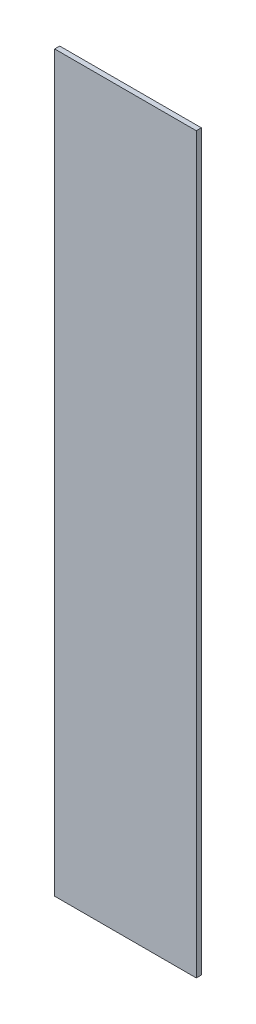
ISO-10303-21;
HEADER;
FILE_DESCRIPTION(('STEP AP214'),'2;1');
FILE_NAME('part.step','',(''),(''),'','','');
FILE_SCHEMA(('AUTOMOTIVE_DESIGN { 1 0 10303 214 1 1 1 1 }'));
ENDSEC;
DATA;
#1=APPLICATION_CONTEXT('core data for automotive mechanical design processes');
#2=APPLICATION_PROTOCOL_DEFINITION('international standard','automotive_design',2000,#1);
#3=PRODUCT_CONTEXT('',#1,'mechanical');
#4=PRODUCT('Part','Part','',(#3));
#5=PRODUCT_RELATED_PRODUCT_CATEGORY('part','',(#4));
#6=PRODUCT_DEFINITION_FORMATION('','',#4);
#7=PRODUCT_DEFINITION_CONTEXT('part definition',#1,'design');
#8=PRODUCT_DEFINITION('design','',#6,#7);
#9=PRODUCT_DEFINITION_SHAPE('','',#8);
#10=(LENGTH_UNIT() NAMED_UNIT(*) SI_UNIT(.MILLI.,.METRE.));
#11=(NAMED_UNIT(*) PLANE_ANGLE_UNIT() SI_UNIT($,.RADIAN.));
#12=(NAMED_UNIT(*) SI_UNIT($,.STERADIAN.) SOLID_ANGLE_UNIT());
#13=UNCERTAINTY_MEASURE_WITH_UNIT(LENGTH_MEASURE(1.E-05),#10,'distance_accuracy_value','');
#14=(GEOMETRIC_REPRESENTATION_CONTEXT(3) GLOBAL_UNCERTAINTY_ASSIGNED_CONTEXT((#13)) GLOBAL_UNIT_ASSIGNED_CONTEXT((#10,
#11,#12)) REPRESENTATION_CONTEXT('',''));
#15=CARTESIAN_POINT('',(0.,0.,0.));
#16=DIRECTION('',(0.,0.,1.));
#17=DIRECTION('',(1.,0.,0.));
#18=AXIS2_PLACEMENT_3D('',#15,#16,#17);
#19=CARTESIAN_POINT('',(88.9,-460.375,6.35));
#20=DIRECTION('',(-1.,0.,0.));
#21=DIRECTION('',(0.,0.,1.));
#22=AXIS2_PLACEMENT_3D('',#19,#20,#21);
#23=PLANE('',#22);
#24=DIRECTION('',(0.,1.,0.));
#25=VECTOR('',#24,1.);
#26=CARTESIAN_POINT('',(88.9,-460.375,0.));
#27=LINE('',#26,#25);
#28=CARTESIAN_POINT('',(88.9,-460.375,0.));
#29=VERTEX_POINT('',#28);
#30=CARTESIAN_POINT('',(88.9,460.375,0.));
#31=VERTEX_POINT('',#30);
#32=EDGE_CURVE('E96',#29,#31,#27,.T.);
#33=ORIENTED_EDGE('',*,*,#32,.T.);
#34=DIRECTION('',(0.,0.,-1.));
#35=VECTOR('',#34,1.);
#36=CARTESIAN_POINT('',(88.9,460.375,6.35));
#37=LINE('',#36,#35);
#38=CARTESIAN_POINT('',(88.9,460.375,6.35));
#39=VERTEX_POINT('',#38);
#40=EDGE_CURVE('E11',#39,#31,#37,.T.);
#41=ORIENTED_EDGE('',*,*,#40,.F.);
#42=DIRECTION('',(0.,1.,0.));
#43=VECTOR('',#42,1.);
#44=CARTESIAN_POINT('',(88.9,-460.375,6.35));
#45=LINE('',#44,#43);
#46=CARTESIAN_POINT('',(88.9,-460.375,6.35));
#47=VERTEX_POINT('',#46);
#48=EDGE_CURVE('E84',#47,#39,#45,.T.);
#49=ORIENTED_EDGE('',*,*,#48,.F.);
#50=DIRECTION('',(0.,0.,-1.));
#51=VECTOR('',#50,1.);
#52=CARTESIAN_POINT('',(88.9,-460.375,6.35));
#53=LINE('',#52,#51);
#54=EDGE_CURVE('E92',#47,#29,#53,.T.);
#55=ORIENTED_EDGE('',*,*,#54,.T.);
#56=EDGE_LOOP('',(#33,#41,#49,#55));
#57=FACE_BOUND('',#56,.T.);
#58=ADVANCED_FACE('F33',(#57),#23,.F.);
#59=CARTESIAN_POINT('',(-88.9,460.375,6.35));
#60=DIRECTION('',(0.,-1.,0.));
#61=DIRECTION('',(0.,0.,-1.));
#62=AXIS2_PLACEMENT_3D('',#59,#60,#61);
#63=PLANE('',#62);
#64=DIRECTION('',(-1.,0.,0.));
#65=VECTOR('',#64,1.);
#66=CARTESIAN_POINT('',(-88.9,460.375,0.));
#67=LINE('',#66,#65);
#68=CARTESIAN_POINT('',(-88.9,460.375,0.));
#69=VERTEX_POINT('',#68);
#70=EDGE_CURVE('E88',#31,#69,#67,.T.);
#71=ORIENTED_EDGE('',*,*,#70,.T.);
#72=DIRECTION('',(0.,0.,-1.));
#73=VECTOR('',#72,1.);
#74=CARTESIAN_POINT('',(-88.9,460.375,6.35));
#75=LINE('',#74,#73);
#76=CARTESIAN_POINT('',(-88.9,460.375,6.35));
#77=VERTEX_POINT('',#76);
#78=EDGE_CURVE('E41',#77,#69,#75,.T.);
#79=ORIENTED_EDGE('',*,*,#78,.F.);
#80=DIRECTION('',(-1.,0.,0.));
#81=VECTOR('',#80,1.);
#82=CARTESIAN_POINT('',(-88.9,460.375,6.35));
#83=LINE('',#82,#81);
#84=EDGE_CURVE('E79',#39,#77,#83,.T.);
#85=ORIENTED_EDGE('',*,*,#84,.F.);
#86=ORIENTED_EDGE('',*,*,#40,.T.);
#87=EDGE_LOOP('',(#71,#79,#85,#86));
#88=FACE_BOUND('',#87,.T.);
#89=ADVANCED_FACE('F87',(#88),#63,.F.);
#90=CARTESIAN_POINT('',(-88.9,-460.375,6.35));
#91=DIRECTION('',(1.,0.,0.));
#92=DIRECTION('',(0.,0.,-1.));
#93=AXIS2_PLACEMENT_3D('',#90,#91,#92);
#94=PLANE('',#93);
#95=DIRECTION('',(0.,-1.,0.));
#96=VECTOR('',#95,1.);
#97=CARTESIAN_POINT('',(-88.9,-460.375,0.));
#98=LINE('',#97,#96);
#99=CARTESIAN_POINT('',(-88.9,-460.375,0.));
#100=VERTEX_POINT('',#99);
#101=EDGE_CURVE('E66',#69,#100,#98,.T.);
#102=ORIENTED_EDGE('',*,*,#101,.T.);
#103=DIRECTION('',(0.,0.,-1.));
#104=VECTOR('',#103,1.);
#105=CARTESIAN_POINT('',(-88.9,-460.375,6.35));
#106=LINE('',#105,#104);
#107=CARTESIAN_POINT('',(-88.9,-460.375,6.35));
#108=VERTEX_POINT('',#107);
#109=EDGE_CURVE('E89',#108,#100,#106,.T.);
#110=ORIENTED_EDGE('',*,*,#109,.F.);
#111=DIRECTION('',(0.,-1.,0.));
#112=VECTOR('',#111,1.);
#113=CARTESIAN_POINT('',(-88.9,-460.375,6.35));
#114=LINE('',#113,#112);
#115=EDGE_CURVE('E82',#77,#108,#114,.T.);
#116=ORIENTED_EDGE('',*,*,#115,.F.);
#117=ORIENTED_EDGE('',*,*,#78,.T.);
#118=EDGE_LOOP('',(#102,#110,#116,#117));
#119=FACE_BOUND('',#118,.T.);
#120=ADVANCED_FACE('F90',(#119),#94,.F.);
#121=CARTESIAN_POINT('',(-88.9,-460.375,6.35));
#122=DIRECTION('',(0.,1.,0.));
#123=DIRECTION('',(0.,0.,1.));
#124=AXIS2_PLACEMENT_3D('',#121,#122,#123);
#125=PLANE('',#124);
#126=DIRECTION('',(1.,0.,0.));
#127=VECTOR('',#126,1.);
#128=CARTESIAN_POINT('',(-88.9,-460.375,0.));
#129=LINE('',#128,#127);
#130=EDGE_CURVE('E72',#100,#29,#129,.T.);
#131=ORIENTED_EDGE('',*,*,#130,.T.);
#132=ORIENTED_EDGE('',*,*,#54,.F.);
#133=DIRECTION('',(1.,0.,0.));
#134=VECTOR('',#133,1.);
#135=CARTESIAN_POINT('',(-88.9,-460.375,6.35));
#136=LINE('',#135,#134);
#137=EDGE_CURVE('E49',#108,#47,#136,.T.);
#138=ORIENTED_EDGE('',*,*,#137,.F.);
#139=ORIENTED_EDGE('',*,*,#109,.T.);
#140=EDGE_LOOP('',(#131,#132,#138,#139));
#141=FACE_BOUND('',#140,.T.);
#142=ADVANCED_FACE('F103',(#141),#125,.F.);
#143=CARTESIAN_POINT('',(0.,0.,6.35));
#144=DIRECTION('',(0.,0.,-1.));
#145=DIRECTION('',(-1.,0.,0.));
#146=AXIS2_PLACEMENT_3D('',#143,#144,#145);
#147=PLANE('',#146);
#148=ORIENTED_EDGE('',*,*,#48,.T.);
#149=ORIENTED_EDGE('',*,*,#84,.T.);
#150=ORIENTED_EDGE('',*,*,#115,.T.);
#151=ORIENTED_EDGE('',*,*,#137,.T.);
#152=EDGE_LOOP('',(#148,#149,#150,#151));
#153=FACE_BOUND('',#152,.T.);
#154=ADVANCED_FACE('F80',(#153),#147,.F.);
#155=CARTESIAN_POINT('',(0.,0.,0.));
#156=DIRECTION('',(0.,0.,-1.));
#157=DIRECTION('',(-1.,0.,0.));
#158=AXIS2_PLACEMENT_3D('',#155,#156,#157);
#159=PLANE('',#158);
#160=ORIENTED_EDGE('',*,*,#32,.F.);
#161=ORIENTED_EDGE('',*,*,#130,.F.);
#162=ORIENTED_EDGE('',*,*,#101,.F.);
#163=ORIENTED_EDGE('',*,*,#70,.F.);
#164=EDGE_LOOP('',(#160,#161,#162,#163));
#165=FACE_BOUND('',#164,.T.);
#166=ADVANCED_FACE('F106',(#165),#159,.T.);
#167=CLOSED_SHELL('',(#58,#89,#120,#142,#154,#166));
#168=MANIFOLD_SOLID_BREP('B2',#167);
#169=ADVANCED_BREP_SHAPE_REPRESENTATION('',(#18,#168),#14);
#170=SHAPE_DEFINITION_REPRESENTATION(#9,#169);
ENDSEC;
END-ISO-10303-21;
